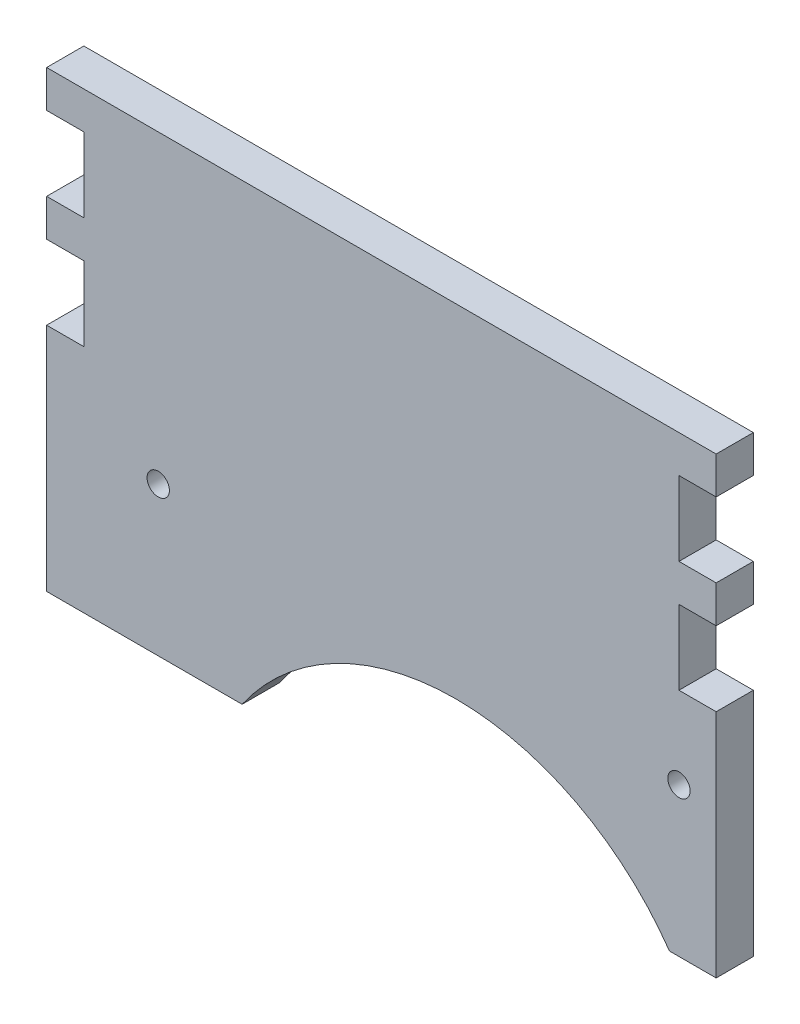
ISO-10303-21;
HEADER;
FILE_DESCRIPTION(('STEP AP214'),'2;1');
FILE_NAME('part.step','',(''),(''),'','','');
FILE_SCHEMA(('AUTOMOTIVE_DESIGN { 1 0 10303 214 1 1 1 1 }'));
ENDSEC;
DATA;
#1=APPLICATION_CONTEXT('core data for automotive mechanical design processes');
#2=APPLICATION_PROTOCOL_DEFINITION('international standard','automotive_design',2000,#1);
#3=PRODUCT_CONTEXT('',#1,'mechanical');
#4=PRODUCT('Part','Part','',(#3));
#5=PRODUCT_RELATED_PRODUCT_CATEGORY('part','',(#4));
#6=PRODUCT_DEFINITION_FORMATION('','',#4);
#7=PRODUCT_DEFINITION_CONTEXT('part definition',#1,'design');
#8=PRODUCT_DEFINITION('design','',#6,#7);
#9=PRODUCT_DEFINITION_SHAPE('','',#8);
#10=(LENGTH_UNIT() NAMED_UNIT(*) SI_UNIT(.MILLI.,.METRE.));
#11=(NAMED_UNIT(*) PLANE_ANGLE_UNIT() SI_UNIT($,.RADIAN.));
#12=(NAMED_UNIT(*) SI_UNIT($,.STERADIAN.) SOLID_ANGLE_UNIT());
#13=UNCERTAINTY_MEASURE_WITH_UNIT(LENGTH_MEASURE(1.E-05),#10,'distance_accuracy_value','');
#14=(GEOMETRIC_REPRESENTATION_CONTEXT(3) GLOBAL_UNCERTAINTY_ASSIGNED_CONTEXT((#13)) GLOBAL_UNIT_ASSIGNED_CONTEXT((#10,
#11,#12)) REPRESENTATION_CONTEXT('',''));
#15=CARTESIAN_POINT('',(0.,0.,0.));
#16=DIRECTION('',(0.,0.,1.));
#17=DIRECTION('',(1.,0.,0.));
#18=AXIS2_PLACEMENT_3D('',#15,#16,#17);
#19=CARTESIAN_POINT('',(0.,0.,5.));
#20=DIRECTION('',(0.,1.,0.));
#21=DIRECTION('',(0.,0.,1.));
#22=AXIS2_PLACEMENT_3D('',#19,#20,#21);
#23=PLANE('',#22);
#24=DIRECTION('',(1.,0.,0.));
#25=VECTOR('',#24,1.);
#26=CARTESIAN_POINT('',(0.,0.,0.));
#27=LINE('',#26,#25);
#28=CARTESIAN_POINT('',(0.,0.,0.));
#29=VERTEX_POINT('',#28);
#30=CARTESIAN_POINT('',(26.2771867673098,0.,0.));
#31=VERTEX_POINT('',#30);
#32=EDGE_CURVE('E224',#29,#31,#27,.T.);
#33=ORIENTED_EDGE('',*,*,#32,.T.);
#34=DIRECTION('',(0.,0.,-1.));
#35=VECTOR('',#34,1.);
#36=CARTESIAN_POINT('',(26.2771867673098,0.,5.));
#37=LINE('',#36,#35);
#38=CARTESIAN_POINT('',(26.2771867673098,0.,5.));
#39=VERTEX_POINT('',#38);
#40=EDGE_CURVE('E11',#39,#31,#37,.T.);
#41=ORIENTED_EDGE('',*,*,#40,.F.);
#42=DIRECTION('',(1.,0.,0.));
#43=VECTOR('',#42,1.);
#44=CARTESIAN_POINT('',(0.,0.,5.));
#45=LINE('',#44,#43);
#46=CARTESIAN_POINT('',(0.,0.,5.));
#47=VERTEX_POINT('',#46);
#48=EDGE_CURVE('E433',#47,#39,#45,.T.);
#49=ORIENTED_EDGE('',*,*,#48,.F.);
#50=DIRECTION('',(0.,0.,-1.));
#51=VECTOR('',#50,1.);
#52=CARTESIAN_POINT('',(0.,0.,5.));
#53=LINE('',#52,#51);
#54=EDGE_CURVE('E52',#47,#29,#53,.T.);
#55=ORIENTED_EDGE('',*,*,#54,.T.);
#56=EDGE_LOOP('',(#33,#41,#49,#55));
#57=FACE_BOUND('',#56,.T.);
#58=ADVANCED_FACE('F35',(#57),#23,.F.);
#59=CARTESIAN_POINT('',(55.,-20.,5.));
#60=DIRECTION('',(0.,0.,-1.));
#61=DIRECTION('',(-1.,0.,0.));
#62=AXIS2_PLACEMENT_3D('',#59,#60,#61);
#63=CYLINDRICAL_SURFACE('',#62,35.);
#64=CARTESIAN_POINT('',(55.,-20.,0.));
#65=DIRECTION('',(0.,0.,1.));
#66=DIRECTION('',(1.,0.,0.));
#67=AXIS2_PLACEMENT_3D('',#64,#65,#66);
#68=CIRCLE('',#67,35.);
#69=CARTESIAN_POINT('',(83.7228132326902,0.,0.));
#70=VERTEX_POINT('',#69);
#71=EDGE_CURVE('E226',#31,#70,#68,.F.);
#72=ORIENTED_EDGE('',*,*,#71,.T.);
#73=DIRECTION('',(0.,0.,-1.));
#74=VECTOR('',#73,1.);
#75=CARTESIAN_POINT('',(83.7228132326902,0.,5.));
#76=LINE('',#75,#74);
#77=CARTESIAN_POINT('',(83.7228132326902,0.,5.));
#78=VERTEX_POINT('',#77);
#79=EDGE_CURVE('E44',#78,#70,#76,.T.);
#80=ORIENTED_EDGE('',*,*,#79,.F.);
#81=CARTESIAN_POINT('',(55.,-20.,5.));
#82=DIRECTION('',(0.,0.,1.));
#83=DIRECTION('',(1.,0.,0.));
#84=AXIS2_PLACEMENT_3D('',#81,#82,#83);
#85=CIRCLE('',#84,35.);
#86=EDGE_CURVE('E132',#39,#78,#85,.F.);
#87=ORIENTED_EDGE('',*,*,#86,.F.);
#88=ORIENTED_EDGE('',*,*,#40,.T.);
#89=EDGE_LOOP('',(#72,#80,#87,#88));
#90=FACE_BOUND('',#89,.T.);
#91=ADVANCED_FACE('F397',(#90),#63,.F.);
#92=CARTESIAN_POINT('',(0.,0.,5.));
#93=DIRECTION('',(0.,1.,0.));
#94=DIRECTION('',(0.,0.,1.));
#95=AXIS2_PLACEMENT_3D('',#92,#93,#94);
#96=PLANE('',#95);
#97=DIRECTION('',(1.,0.,0.));
#98=VECTOR('',#97,1.);
#99=CARTESIAN_POINT('',(0.,0.,0.));
#100=LINE('',#99,#98);
#101=CARTESIAN_POINT('',(90.,0.,0.));
#102=VERTEX_POINT('',#101);
#103=EDGE_CURVE('E228',#70,#102,#100,.T.);
#104=ORIENTED_EDGE('',*,*,#103,.T.);
#105=DIRECTION('',(0.,0.,-1.));
#106=VECTOR('',#105,1.);
#107=CARTESIAN_POINT('',(90.,0.,5.));
#108=LINE('',#107,#106);
#109=CARTESIAN_POINT('',(90.,0.,5.));
#110=VERTEX_POINT('',#109);
#111=EDGE_CURVE('E317',#110,#102,#108,.T.);
#112=ORIENTED_EDGE('',*,*,#111,.F.);
#113=DIRECTION('',(1.,0.,0.));
#114=VECTOR('',#113,1.);
#115=CARTESIAN_POINT('',(0.,0.,5.));
#116=LINE('',#115,#114);
#117=EDGE_CURVE('E325',#78,#110,#116,.T.);
#118=ORIENTED_EDGE('',*,*,#117,.F.);
#119=ORIENTED_EDGE('',*,*,#79,.T.);
#120=EDGE_LOOP('',(#104,#112,#118,#119));
#121=FACE_BOUND('',#120,.T.);
#122=ADVANCED_FACE('F323',(#121),#96,.F.);
#123=CARTESIAN_POINT('',(90.,0.,5.));
#124=DIRECTION('',(-1.,0.,0.));
#125=DIRECTION('',(0.,-1.,0.));
#126=AXIS2_PLACEMENT_3D('',#123,#124,#125);
#127=PLANE('',#126);
#128=DIRECTION('',(0.,1.,0.));
#129=VECTOR('',#128,1.);
#130=CARTESIAN_POINT('',(90.,0.,0.));
#131=LINE('',#130,#129);
#132=CARTESIAN_POINT('',(90.,31.,0.));
#133=VERTEX_POINT('',#132);
#134=EDGE_CURVE('E230',#102,#133,#131,.T.);
#135=ORIENTED_EDGE('',*,*,#134,.T.);
#136=DIRECTION('',(0.,0.,-1.));
#137=VECTOR('',#136,1.);
#138=CARTESIAN_POINT('',(90.,31.,5.));
#139=LINE('',#138,#137);
#140=CARTESIAN_POINT('',(90.,31.,5.));
#141=VERTEX_POINT('',#140);
#142=EDGE_CURVE('E315',#141,#133,#139,.T.);
#143=ORIENTED_EDGE('',*,*,#142,.F.);
#144=DIRECTION('',(0.,1.,0.));
#145=VECTOR('',#144,1.);
#146=CARTESIAN_POINT('',(90.,0.,5.));
#147=LINE('',#146,#145);
#148=EDGE_CURVE('E335',#110,#141,#147,.T.);
#149=ORIENTED_EDGE('',*,*,#148,.F.);
#150=ORIENTED_EDGE('',*,*,#111,.T.);
#151=EDGE_LOOP('',(#135,#143,#149,#150));
#152=FACE_BOUND('',#151,.T.);
#153=ADVANCED_FACE('F332',(#152),#127,.F.);
#154=CARTESIAN_POINT('',(0.,31.,5.));
#155=DIRECTION('',(0.,1.,0.));
#156=DIRECTION('',(-1.,0.,0.));
#157=AXIS2_PLACEMENT_3D('',#154,#155,#156);
#158=PLANE('',#157);
#159=DIRECTION('',(1.,0.,0.));
#160=VECTOR('',#159,1.);
#161=CARTESIAN_POINT('',(0.,31.,0.));
#162=LINE('',#161,#160);
#163=CARTESIAN_POINT('',(85.,31.,0.));
#164=VERTEX_POINT('',#163);
#165=EDGE_CURVE('E233',#164,#133,#162,.T.);
#166=ORIENTED_EDGE('',*,*,#165,.F.);
#167=DIRECTION('',(0.,0.,-1.));
#168=VECTOR('',#167,1.);
#169=CARTESIAN_POINT('',(85.,31.,5.));
#170=LINE('',#169,#168);
#171=CARTESIAN_POINT('',(85.,31.,5.));
#172=VERTEX_POINT('',#171);
#173=EDGE_CURVE('E313',#172,#164,#170,.T.);
#174=ORIENTED_EDGE('',*,*,#173,.F.);
#175=DIRECTION('',(1.,0.,0.));
#176=VECTOR('',#175,1.);
#177=CARTESIAN_POINT('',(0.,31.,5.));
#178=LINE('',#177,#176);
#179=EDGE_CURVE('E337',#172,#141,#178,.T.);
#180=ORIENTED_EDGE('',*,*,#179,.T.);
#181=ORIENTED_EDGE('',*,*,#142,.T.);
#182=EDGE_LOOP('',(#166,#174,#180,#181));
#183=FACE_BOUND('',#182,.T.);
#184=ADVANCED_FACE('F589',(#183),#158,.T.);
#185=CARTESIAN_POINT('',(85.,0.,5.));
#186=DIRECTION('',(1.,0.,0.));
#187=DIRECTION('',(0.,0.,-1.));
#188=AXIS2_PLACEMENT_3D('',#185,#186,#187);
#189=PLANE('',#188);
#190=DIRECTION('',(0.,-1.,0.));
#191=VECTOR('',#190,1.);
#192=CARTESIAN_POINT('',(85.,0.,0.));
#193=LINE('',#192,#191);
#194=CARTESIAN_POINT('',(85.,41.,0.));
#195=VERTEX_POINT('',#194);
#196=EDGE_CURVE('E236',#195,#164,#193,.T.);
#197=ORIENTED_EDGE('',*,*,#196,.F.);
#198=DIRECTION('',(0.,0.,-1.));
#199=VECTOR('',#198,1.);
#200=CARTESIAN_POINT('',(85.,41.,5.));
#201=LINE('',#200,#199);
#202=CARTESIAN_POINT('',(85.,41.,5.));
#203=VERTEX_POINT('',#202);
#204=EDGE_CURVE('E311',#203,#195,#201,.T.);
#205=ORIENTED_EDGE('',*,*,#204,.F.);
#206=DIRECTION('',(0.,-1.,0.));
#207=VECTOR('',#206,1.);
#208=CARTESIAN_POINT('',(85.,0.,5.));
#209=LINE('',#208,#207);
#210=EDGE_CURVE('E339',#203,#172,#209,.T.);
#211=ORIENTED_EDGE('',*,*,#210,.T.);
#212=ORIENTED_EDGE('',*,*,#173,.T.);
#213=EDGE_LOOP('',(#197,#205,#211,#212));
#214=FACE_BOUND('',#213,.T.);
#215=ADVANCED_FACE('F580',(#214),#189,.T.);
#216=CARTESIAN_POINT('',(0.,41.,5.));
#217=DIRECTION('',(0.,1.,0.));
#218=DIRECTION('',(0.,0.,1.));
#219=AXIS2_PLACEMENT_3D('',#216,#217,#218);
#220=PLANE('',#219);
#221=DIRECTION('',(1.,0.,0.));
#222=VECTOR('',#221,1.);
#223=CARTESIAN_POINT('',(0.,41.,0.));
#224=LINE('',#223,#222);
#225=CARTESIAN_POINT('',(90.,41.,0.));
#226=VERTEX_POINT('',#225);
#227=EDGE_CURVE('E239',#195,#226,#224,.T.);
#228=ORIENTED_EDGE('',*,*,#227,.T.);
#229=DIRECTION('',(0.,0.,-1.));
#230=VECTOR('',#229,1.);
#231=CARTESIAN_POINT('',(90.,41.,5.));
#232=LINE('',#231,#230);
#233=CARTESIAN_POINT('',(90.,41.,5.));
#234=VERTEX_POINT('',#233);
#235=EDGE_CURVE('E308',#234,#226,#232,.T.);
#236=ORIENTED_EDGE('',*,*,#235,.F.);
#237=DIRECTION('',(1.,0.,0.));
#238=VECTOR('',#237,1.);
#239=CARTESIAN_POINT('',(0.,41.,5.));
#240=LINE('',#239,#238);
#241=EDGE_CURVE('E346',#203,#234,#240,.T.);
#242=ORIENTED_EDGE('',*,*,#241,.F.);
#243=ORIENTED_EDGE('',*,*,#204,.T.);
#244=EDGE_LOOP('',(#228,#236,#242,#243));
#245=FACE_BOUND('',#244,.T.);
#246=ADVANCED_FACE('F571',(#245),#220,.F.);
#247=CARTESIAN_POINT('',(90.0000000000001,2.49800180540661E-13,5.));
#248=DIRECTION('',(-1.,0.,0.));
#249=DIRECTION('',(0.,-1.,0.));
#250=AXIS2_PLACEMENT_3D('',#247,#248,#249);
#251=PLANE('',#250);
#252=DIRECTION('',(0.,1.,0.));
#253=VECTOR('',#252,1.);
#254=CARTESIAN_POINT('',(90.0000000000001,2.49800180540661E-13,0.));
#255=LINE('',#254,#253);
#256=CARTESIAN_POINT('',(90.,46.,0.));
#257=VERTEX_POINT('',#256);
#258=EDGE_CURVE('E241',#226,#257,#255,.T.);
#259=ORIENTED_EDGE('',*,*,#258,.T.);
#260=DIRECTION('',(0.,0.,-1.));
#261=VECTOR('',#260,1.);
#262=CARTESIAN_POINT('',(90.,46.,5.));
#263=LINE('',#262,#261);
#264=CARTESIAN_POINT('',(90.,46.,5.));
#265=VERTEX_POINT('',#264);
#266=EDGE_CURVE('E306',#265,#257,#263,.T.);
#267=ORIENTED_EDGE('',*,*,#266,.F.);
#268=DIRECTION('',(0.,1.,0.));
#269=VECTOR('',#268,1.);
#270=CARTESIAN_POINT('',(90.0000000000001,2.49800180540661E-13,5.));
#271=LINE('',#270,#269);
#272=EDGE_CURVE('E348',#234,#265,#271,.T.);
#273=ORIENTED_EDGE('',*,*,#272,.F.);
#274=ORIENTED_EDGE('',*,*,#235,.T.);
#275=EDGE_LOOP('',(#259,#267,#273,#274));
#276=FACE_BOUND('',#275,.T.);
#277=ADVANCED_FACE('F562',(#276),#251,.F.);
#278=CARTESIAN_POINT('',(0.,46.,5.));
#279=DIRECTION('',(0.,1.,0.));
#280=DIRECTION('',(0.,0.,1.));
#281=AXIS2_PLACEMENT_3D('',#278,#279,#280);
#282=PLANE('',#281);
#283=DIRECTION('',(1.,0.,0.));
#284=VECTOR('',#283,1.);
#285=CARTESIAN_POINT('',(0.,46.,0.));
#286=LINE('',#285,#284);
#287=CARTESIAN_POINT('',(85.,46.,0.));
#288=VERTEX_POINT('',#287);
#289=EDGE_CURVE('E244',#288,#257,#286,.T.);
#290=ORIENTED_EDGE('',*,*,#289,.F.);
#291=DIRECTION('',(0.,0.,-1.));
#292=VECTOR('',#291,1.);
#293=CARTESIAN_POINT('',(85.,46.,5.));
#294=LINE('',#293,#292);
#295=CARTESIAN_POINT('',(85.,46.,5.));
#296=VERTEX_POINT('',#295);
#297=EDGE_CURVE('E304',#296,#288,#294,.T.);
#298=ORIENTED_EDGE('',*,*,#297,.F.);
#299=DIRECTION('',(1.,0.,0.));
#300=VECTOR('',#299,1.);
#301=CARTESIAN_POINT('',(0.,46.,5.));
#302=LINE('',#301,#300);
#303=EDGE_CURVE('E350',#296,#265,#302,.T.);
#304=ORIENTED_EDGE('',*,*,#303,.T.);
#305=ORIENTED_EDGE('',*,*,#266,.T.);
#306=EDGE_LOOP('',(#290,#298,#304,#305));
#307=FACE_BOUND('',#306,.T.);
#308=ADVANCED_FACE('F553',(#307),#282,.T.);
#309=CARTESIAN_POINT('',(85.,0.,5.));
#310=DIRECTION('',(1.,0.,0.));
#311=DIRECTION('',(0.,0.,-1.));
#312=AXIS2_PLACEMENT_3D('',#309,#310,#311);
#313=PLANE('',#312);
#314=DIRECTION('',(0.,-1.,0.));
#315=VECTOR('',#314,1.);
#316=CARTESIAN_POINT('',(85.,0.,0.));
#317=LINE('',#316,#315);
#318=CARTESIAN_POINT('',(85.,56.,0.));
#319=VERTEX_POINT('',#318);
#320=EDGE_CURVE('E247',#319,#288,#317,.T.);
#321=ORIENTED_EDGE('',*,*,#320,.F.);
#322=DIRECTION('',(0.,0.,-1.));
#323=VECTOR('',#322,1.);
#324=CARTESIAN_POINT('',(85.,56.,5.));
#325=LINE('',#324,#323);
#326=CARTESIAN_POINT('',(85.,56.,5.));
#327=VERTEX_POINT('',#326);
#328=EDGE_CURVE('E302',#327,#319,#325,.T.);
#329=ORIENTED_EDGE('',*,*,#328,.F.);
#330=DIRECTION('',(0.,-1.,0.));
#331=VECTOR('',#330,1.);
#332=CARTESIAN_POINT('',(85.,0.,5.));
#333=LINE('',#332,#331);
#334=EDGE_CURVE('E353',#327,#296,#333,.T.);
#335=ORIENTED_EDGE('',*,*,#334,.T.);
#336=ORIENTED_EDGE('',*,*,#297,.T.);
#337=EDGE_LOOP('',(#321,#329,#335,#336));
#338=FACE_BOUND('',#337,.T.);
#339=ADVANCED_FACE('F544',(#338),#313,.T.);
#340=CARTESIAN_POINT('',(0.,56.,5.));
#341=DIRECTION('',(0.,1.,0.));
#342=DIRECTION('',(0.,0.,1.));
#343=AXIS2_PLACEMENT_3D('',#340,#341,#342);
#344=PLANE('',#343);
#345=DIRECTION('',(1.,0.,0.));
#346=VECTOR('',#345,1.);
#347=CARTESIAN_POINT('',(0.,56.,0.));
#348=LINE('',#347,#346);
#349=CARTESIAN_POINT('',(90.,56.,0.));
#350=VERTEX_POINT('',#349);
#351=EDGE_CURVE('E250',#319,#350,#348,.T.);
#352=ORIENTED_EDGE('',*,*,#351,.T.);
#353=DIRECTION('',(0.,0.,-1.));
#354=VECTOR('',#353,1.);
#355=CARTESIAN_POINT('',(90.,56.,5.));
#356=LINE('',#355,#354);
#357=CARTESIAN_POINT('',(90.,56.,5.));
#358=VERTEX_POINT('',#357);
#359=EDGE_CURVE('E299',#358,#350,#356,.T.);
#360=ORIENTED_EDGE('',*,*,#359,.F.);
#361=DIRECTION('',(1.,0.,0.));
#362=VECTOR('',#361,1.);
#363=CARTESIAN_POINT('',(0.,56.,5.));
#364=LINE('',#363,#362);
#365=EDGE_CURVE('E356',#327,#358,#364,.T.);
#366=ORIENTED_EDGE('',*,*,#365,.F.);
#367=ORIENTED_EDGE('',*,*,#328,.T.);
#368=EDGE_LOOP('',(#352,#360,#366,#367));
#369=FACE_BOUND('',#368,.T.);
#370=ADVANCED_FACE('F535',(#369),#344,.F.);
#371=CARTESIAN_POINT('',(90.,0.,5.));
#372=DIRECTION('',(-1.,0.,0.));
#373=DIRECTION('',(0.,0.,1.));
#374=AXIS2_PLACEMENT_3D('',#371,#372,#373);
#375=PLANE('',#374);
#376=DIRECTION('',(0.,1.,0.));
#377=VECTOR('',#376,1.);
#378=CARTESIAN_POINT('',(90.,0.,0.));
#379=LINE('',#378,#377);
#380=CARTESIAN_POINT('',(90.,61.,0.));
#381=VERTEX_POINT('',#380);
#382=EDGE_CURVE('E252',#350,#381,#379,.T.);
#383=ORIENTED_EDGE('',*,*,#382,.T.);
#384=DIRECTION('',(0.,0.,-1.));
#385=VECTOR('',#384,1.);
#386=CARTESIAN_POINT('',(90.,61.,5.));
#387=LINE('',#386,#385);
#388=CARTESIAN_POINT('',(90.,61.,5.));
#389=VERTEX_POINT('',#388);
#390=EDGE_CURVE('E297',#389,#381,#387,.T.);
#391=ORIENTED_EDGE('',*,*,#390,.F.);
#392=DIRECTION('',(0.,1.,0.));
#393=VECTOR('',#392,1.);
#394=CARTESIAN_POINT('',(90.,0.,5.));
#395=LINE('',#394,#393);
#396=EDGE_CURVE('E358',#358,#389,#395,.T.);
#397=ORIENTED_EDGE('',*,*,#396,.F.);
#398=ORIENTED_EDGE('',*,*,#359,.T.);
#399=EDGE_LOOP('',(#383,#391,#397,#398));
#400=FACE_BOUND('',#399,.T.);
#401=ADVANCED_FACE('F526',(#400),#375,.F.);
#402=CARTESIAN_POINT('',(0.,61.,5.));
#403=DIRECTION('',(0.,1.,0.));
#404=DIRECTION('',(0.,0.,1.));
#405=AXIS2_PLACEMENT_3D('',#402,#403,#404);
#406=PLANE('',#405);
#407=DIRECTION('',(1.,0.,0.));
#408=VECTOR('',#407,1.);
#409=CARTESIAN_POINT('',(0.,61.,0.));
#410=LINE('',#409,#408);
#411=CARTESIAN_POINT('',(0.,61.,0.));
#412=VERTEX_POINT('',#411);
#413=EDGE_CURVE('E255',#412,#381,#410,.T.);
#414=ORIENTED_EDGE('',*,*,#413,.F.);
#415=DIRECTION('',(0.,0.,-1.));
#416=VECTOR('',#415,1.);
#417=CARTESIAN_POINT('',(0.,61.,5.));
#418=LINE('',#417,#416);
#419=CARTESIAN_POINT('',(0.,61.,5.));
#420=VERTEX_POINT('',#419);
#421=EDGE_CURVE('E295',#420,#412,#418,.T.);
#422=ORIENTED_EDGE('',*,*,#421,.F.);
#423=DIRECTION('',(1.,0.,0.));
#424=VECTOR('',#423,1.);
#425=CARTESIAN_POINT('',(0.,61.,5.));
#426=LINE('',#425,#424);
#427=EDGE_CURVE('E360',#420,#389,#426,.T.);
#428=ORIENTED_EDGE('',*,*,#427,.T.);
#429=ORIENTED_EDGE('',*,*,#390,.T.);
#430=EDGE_LOOP('',(#414,#422,#428,#429));
#431=FACE_BOUND('',#430,.T.);
#432=ADVANCED_FACE('F517',(#431),#406,.T.);
#433=CARTESIAN_POINT('',(0.,0.,5.));
#434=DIRECTION('',(-1.,0.,0.));
#435=DIRECTION('',(0.,0.,1.));
#436=AXIS2_PLACEMENT_3D('',#433,#434,#435);
#437=PLANE('',#436);
#438=DIRECTION('',(0.,1.,0.));
#439=VECTOR('',#438,1.);
#440=CARTESIAN_POINT('',(0.,0.,0.));
#441=LINE('',#440,#439);
#442=CARTESIAN_POINT('',(0.,56.,0.));
#443=VERTEX_POINT('',#442);
#444=EDGE_CURVE('E258',#443,#412,#441,.T.);
#445=ORIENTED_EDGE('',*,*,#444,.F.);
#446=DIRECTION('',(0.,0.,-1.));
#447=VECTOR('',#446,1.);
#448=CARTESIAN_POINT('',(0.,56.,5.));
#449=LINE('',#448,#447);
#450=CARTESIAN_POINT('',(0.,56.,5.));
#451=VERTEX_POINT('',#450);
#452=EDGE_CURVE('E293',#451,#443,#449,.T.);
#453=ORIENTED_EDGE('',*,*,#452,.F.);
#454=DIRECTION('',(0.,1.,0.));
#455=VECTOR('',#454,1.);
#456=CARTESIAN_POINT('',(0.,0.,5.));
#457=LINE('',#456,#455);
#458=EDGE_CURVE('E363',#451,#420,#457,.T.);
#459=ORIENTED_EDGE('',*,*,#458,.T.);
#460=ORIENTED_EDGE('',*,*,#421,.T.);
#461=EDGE_LOOP('',(#445,#453,#459,#460));
#462=FACE_BOUND('',#461,.T.);
#463=ADVANCED_FACE('F508',(#462),#437,.T.);
#464=CARTESIAN_POINT('',(0.,56.,5.));
#465=DIRECTION('',(0.,1.,0.));
#466=DIRECTION('',(0.,0.,1.));
#467=AXIS2_PLACEMENT_3D('',#464,#465,#466);
#468=PLANE('',#467);
#469=DIRECTION('',(1.,0.,0.));
#470=VECTOR('',#469,1.);
#471=CARTESIAN_POINT('',(0.,56.,0.));
#472=LINE('',#471,#470);
#473=CARTESIAN_POINT('',(5.,56.,0.));
#474=VERTEX_POINT('',#473);
#475=EDGE_CURVE('E261',#443,#474,#472,.T.);
#476=ORIENTED_EDGE('',*,*,#475,.T.);
#477=DIRECTION('',(0.,0.,-1.));
#478=VECTOR('',#477,1.);
#479=CARTESIAN_POINT('',(5.,56.,5.));
#480=LINE('',#479,#478);
#481=CARTESIAN_POINT('',(5.,56.,5.));
#482=VERTEX_POINT('',#481);
#483=EDGE_CURVE('E290',#482,#474,#480,.T.);
#484=ORIENTED_EDGE('',*,*,#483,.F.);
#485=DIRECTION('',(1.,0.,0.));
#486=VECTOR('',#485,1.);
#487=CARTESIAN_POINT('',(0.,56.,5.));
#488=LINE('',#487,#486);
#489=EDGE_CURVE('E366',#451,#482,#488,.T.);
#490=ORIENTED_EDGE('',*,*,#489,.F.);
#491=ORIENTED_EDGE('',*,*,#452,.T.);
#492=EDGE_LOOP('',(#476,#484,#490,#491));
#493=FACE_BOUND('',#492,.T.);
#494=ADVANCED_FACE('F499',(#493),#468,.F.);
#495=CARTESIAN_POINT('',(5.00000000000001,0.,5.));
#496=DIRECTION('',(1.,0.,0.));
#497=DIRECTION('',(0.,1.,0.));
#498=AXIS2_PLACEMENT_3D('',#495,#496,#497);
#499=PLANE('',#498);
#500=DIRECTION('',(0.,-1.,0.));
#501=VECTOR('',#500,1.);
#502=CARTESIAN_POINT('',(5.00000000000001,0.,0.));
#503=LINE('',#502,#501);
#504=CARTESIAN_POINT('',(5.00000000000001,46.,0.));
#505=VERTEX_POINT('',#504);
#506=EDGE_CURVE('E263',#474,#505,#503,.T.);
#507=ORIENTED_EDGE('',*,*,#506,.T.);
#508=DIRECTION('',(0.,0.,-1.));
#509=VECTOR('',#508,1.);
#510=CARTESIAN_POINT('',(5.00000000000001,46.,5.));
#511=LINE('',#510,#509);
#512=CARTESIAN_POINT('',(5.00000000000001,46.,5.));
#513=VERTEX_POINT('',#512);
#514=EDGE_CURVE('E288',#513,#505,#511,.T.);
#515=ORIENTED_EDGE('',*,*,#514,.F.);
#516=DIRECTION('',(0.,-1.,0.));
#517=VECTOR('',#516,1.);
#518=CARTESIAN_POINT('',(5.00000000000001,0.,5.));
#519=LINE('',#518,#517);
#520=EDGE_CURVE('E368',#482,#513,#519,.T.);
#521=ORIENTED_EDGE('',*,*,#520,.F.);
#522=ORIENTED_EDGE('',*,*,#483,.T.);
#523=EDGE_LOOP('',(#507,#515,#521,#522));
#524=FACE_BOUND('',#523,.T.);
#525=ADVANCED_FACE('F491',(#524),#499,.F.);
#526=CARTESIAN_POINT('',(0.,46.,5.));
#527=DIRECTION('',(0.,1.,0.));
#528=DIRECTION('',(0.,0.,1.));
#529=AXIS2_PLACEMENT_3D('',#526,#527,#528);
#530=PLANE('',#529);
#531=DIRECTION('',(1.,0.,0.));
#532=VECTOR('',#531,1.);
#533=CARTESIAN_POINT('',(0.,46.,0.));
#534=LINE('',#533,#532);
#535=CARTESIAN_POINT('',(0.,46.,0.));
#536=VERTEX_POINT('',#535);
#537=EDGE_CURVE('E266',#536,#505,#534,.T.);
#538=ORIENTED_EDGE('',*,*,#537,.F.);
#539=DIRECTION('',(0.,0.,-1.));
#540=VECTOR('',#539,1.);
#541=CARTESIAN_POINT('',(0.,46.,5.));
#542=LINE('',#541,#540);
#543=CARTESIAN_POINT('',(0.,46.,5.));
#544=VERTEX_POINT('',#543);
#545=EDGE_CURVE('E286',#544,#536,#542,.T.);
#546=ORIENTED_EDGE('',*,*,#545,.F.);
#547=DIRECTION('',(1.,0.,0.));
#548=VECTOR('',#547,1.);
#549=CARTESIAN_POINT('',(0.,46.,5.));
#550=LINE('',#549,#548);
#551=EDGE_CURVE('E370',#544,#513,#550,.T.);
#552=ORIENTED_EDGE('',*,*,#551,.T.);
#553=ORIENTED_EDGE('',*,*,#514,.T.);
#554=EDGE_LOOP('',(#538,#546,#552,#553));
#555=FACE_BOUND('',#554,.T.);
#556=ADVANCED_FACE('F383',(#555),#530,.T.);
#557=CARTESIAN_POINT('',(0.,0.,5.));
#558=DIRECTION('',(-1.,0.,0.));
#559=DIRECTION('',(0.,-1.,0.));
#560=AXIS2_PLACEMENT_3D('',#557,#558,#559);
#561=PLANE('',#560);
#562=DIRECTION('',(0.,1.,0.));
#563=VECTOR('',#562,1.);
#564=CARTESIAN_POINT('',(0.,0.,0.));
#565=LINE('',#564,#563);
#566=CARTESIAN_POINT('',(0.,41.,0.));
#567=VERTEX_POINT('',#566);
#568=EDGE_CURVE('E269',#567,#536,#565,.T.);
#569=ORIENTED_EDGE('',*,*,#568,.F.);
#570=DIRECTION('',(0.,0.,-1.));
#571=VECTOR('',#570,1.);
#572=CARTESIAN_POINT('',(0.,41.,5.));
#573=LINE('',#572,#571);
#574=CARTESIAN_POINT('',(0.,41.,5.));
#575=VERTEX_POINT('',#574);
#576=EDGE_CURVE('E284',#575,#567,#573,.T.);
#577=ORIENTED_EDGE('',*,*,#576,.F.);
#578=DIRECTION('',(0.,1.,0.));
#579=VECTOR('',#578,1.);
#580=CARTESIAN_POINT('',(0.,0.,5.));
#581=LINE('',#580,#579);
#582=EDGE_CURVE('E373',#575,#544,#581,.T.);
#583=ORIENTED_EDGE('',*,*,#582,.T.);
#584=ORIENTED_EDGE('',*,*,#545,.T.);
#585=EDGE_LOOP('',(#569,#577,#583,#584));
#586=FACE_BOUND('',#585,.T.);
#587=ADVANCED_FACE('F377',(#586),#561,.T.);
#588=CARTESIAN_POINT('',(0.,41.,5.));
#589=DIRECTION('',(0.,1.,0.));
#590=DIRECTION('',(0.,0.,1.));
#591=AXIS2_PLACEMENT_3D('',#588,#589,#590);
#592=PLANE('',#591);
#593=DIRECTION('',(1.,0.,0.));
#594=VECTOR('',#593,1.);
#595=CARTESIAN_POINT('',(0.,41.,0.));
#596=LINE('',#595,#594);
#597=CARTESIAN_POINT('',(5.00000000000001,41.,0.));
#598=VERTEX_POINT('',#597);
#599=EDGE_CURVE('E272',#567,#598,#596,.T.);
#600=ORIENTED_EDGE('',*,*,#599,.T.);
#601=DIRECTION('',(0.,0.,-1.));
#602=VECTOR('',#601,1.);
#603=CARTESIAN_POINT('',(5.00000000000001,41.,5.));
#604=LINE('',#603,#602);
#605=CARTESIAN_POINT('',(5.00000000000001,41.,5.));
#606=VERTEX_POINT('',#605);
#607=EDGE_CURVE('E210',#606,#598,#604,.T.);
#608=ORIENTED_EDGE('',*,*,#607,.F.);
#609=DIRECTION('',(1.,0.,0.));
#610=VECTOR('',#609,1.);
#611=CARTESIAN_POINT('',(0.,41.,5.));
#612=LINE('',#611,#610);
#613=EDGE_CURVE('E198',#575,#606,#612,.T.);
#614=ORIENTED_EDGE('',*,*,#613,.F.);
#615=ORIENTED_EDGE('',*,*,#576,.T.);
#616=EDGE_LOOP('',(#600,#608,#614,#615));
#617=FACE_BOUND('',#616,.T.);
#618=ADVANCED_FACE('F387',(#617),#592,.F.);
#619=CARTESIAN_POINT('',(5.00000000000001,0.,5.));
#620=DIRECTION('',(1.,0.,0.));
#621=DIRECTION('',(0.,1.,0.));
#622=AXIS2_PLACEMENT_3D('',#619,#620,#621);
#623=PLANE('',#622);
#624=DIRECTION('',(0.,-1.,0.));
#625=VECTOR('',#624,1.);
#626=CARTESIAN_POINT('',(5.00000000000001,0.,0.));
#627=LINE('',#626,#625);
#628=CARTESIAN_POINT('',(5.00000000000001,31.,0.));
#629=VERTEX_POINT('',#628);
#630=EDGE_CURVE('E207',#598,#629,#627,.T.);
#631=ORIENTED_EDGE('',*,*,#630,.T.);
#632=DIRECTION('',(0.,0.,-1.));
#633=VECTOR('',#632,1.);
#634=CARTESIAN_POINT('',(5.00000000000001,31.,5.));
#635=LINE('',#634,#633);
#636=CARTESIAN_POINT('',(5.00000000000001,31.,5.));
#637=VERTEX_POINT('',#636);
#638=EDGE_CURVE('E204',#637,#629,#635,.T.);
#639=ORIENTED_EDGE('',*,*,#638,.F.);
#640=DIRECTION('',(0.,-1.,0.));
#641=VECTOR('',#640,1.);
#642=CARTESIAN_POINT('',(5.00000000000001,0.,5.));
#643=LINE('',#642,#641);
#644=EDGE_CURVE('E190',#606,#637,#643,.T.);
#645=ORIENTED_EDGE('',*,*,#644,.F.);
#646=ORIENTED_EDGE('',*,*,#607,.T.);
#647=EDGE_LOOP('',(#631,#639,#645,#646));
#648=FACE_BOUND('',#647,.T.);
#649=ADVANCED_FACE('F205',(#648),#623,.F.);
#650=CARTESIAN_POINT('',(0.,31.,5.));
#651=DIRECTION('',(0.,1.,0.));
#652=DIRECTION('',(0.,0.,1.));
#653=AXIS2_PLACEMENT_3D('',#650,#651,#652);
#654=PLANE('',#653);
#655=DIRECTION('',(1.,0.,0.));
#656=VECTOR('',#655,1.);
#657=CARTESIAN_POINT('',(0.,31.,0.));
#658=LINE('',#657,#656);
#659=CARTESIAN_POINT('',(0.,31.,0.));
#660=VERTEX_POINT('',#659);
#661=EDGE_CURVE('E275',#660,#629,#658,.T.);
#662=ORIENTED_EDGE('',*,*,#661,.F.);
#663=DIRECTION('',(0.,0.,-1.));
#664=VECTOR('',#663,1.);
#665=CARTESIAN_POINT('',(0.,31.,5.));
#666=LINE('',#665,#664);
#667=CARTESIAN_POINT('',(0.,31.,5.));
#668=VERTEX_POINT('',#667);
#669=EDGE_CURVE('E120',#668,#660,#666,.T.);
#670=ORIENTED_EDGE('',*,*,#669,.F.);
#671=DIRECTION('',(1.,0.,0.));
#672=VECTOR('',#671,1.);
#673=CARTESIAN_POINT('',(0.,31.,5.));
#674=LINE('',#673,#672);
#675=EDGE_CURVE('E195',#668,#637,#674,.T.);
#676=ORIENTED_EDGE('',*,*,#675,.T.);
#677=ORIENTED_EDGE('',*,*,#638,.T.);
#678=EDGE_LOOP('',(#662,#670,#676,#677));
#679=FACE_BOUND('',#678,.T.);
#680=ADVANCED_FACE('F212',(#679),#654,.T.);
#681=CARTESIAN_POINT('',(85.,20.,5.));
#682=DIRECTION('',(0.,0.,-1.));
#683=DIRECTION('',(-1.,0.,0.));
#684=AXIS2_PLACEMENT_3D('',#681,#682,#683);
#685=CYLINDRICAL_SURFACE('',#684,1.5);
#686=CARTESIAN_POINT('',(85.,20.,5.));
#687=DIRECTION('',(0.,0.,1.));
#688=DIRECTION('',(1.,0.,0.));
#689=AXIS2_PLACEMENT_3D('',#686,#687,#688);
#690=CIRCLE('',#689,1.5);
#691=CARTESIAN_POINT('',(86.5,20.,5.));
#692=VERTEX_POINT('',#691);
#693=EDGE_CURVE('E417',#692,#692,#690,.T.);
#694=ORIENTED_EDGE('',*,*,#693,.T.);
#695=EDGE_LOOP('',(#694));
#696=FACE_BOUND('',#695,.T.);
#697=CARTESIAN_POINT('',(85.,20.,0.));
#698=DIRECTION('',(0.,0.,1.));
#699=DIRECTION('',(1.,0.,0.));
#700=AXIS2_PLACEMENT_3D('',#697,#698,#699);
#701=CIRCLE('',#700,1.5);
#702=CARTESIAN_POINT('',(86.5,20.,0.));
#703=VERTEX_POINT('',#702);
#704=EDGE_CURVE('E221',#703,#703,#701,.T.);
#705=ORIENTED_EDGE('',*,*,#704,.F.);
#706=EDGE_LOOP('',(#705));
#707=FACE_BOUND('',#706,.T.);
#708=ADVANCED_FACE('F404',(#696,#707),#685,.F.);
#709=CARTESIAN_POINT('',(15.,20.,5.));
#710=DIRECTION('',(0.,0.,-1.));
#711=DIRECTION('',(-1.,0.,0.));
#712=AXIS2_PLACEMENT_3D('',#709,#710,#711);
#713=CYLINDRICAL_SURFACE('',#712,1.5);
#714=CARTESIAN_POINT('',(15.,20.,5.));
#715=DIRECTION('',(0.,0.,1.));
#716=DIRECTION('',(1.,0.,0.));
#717=AXIS2_PLACEMENT_3D('',#714,#715,#716);
#718=CIRCLE('',#717,1.5);
#719=CARTESIAN_POINT('',(16.5,20.,5.));
#720=VERTEX_POINT('',#719);
#721=EDGE_CURVE('E280',#720,#720,#718,.T.);
#722=ORIENTED_EDGE('',*,*,#721,.T.);
#723=EDGE_LOOP('',(#722));
#724=FACE_BOUND('',#723,.T.);
#725=CARTESIAN_POINT('',(15.,20.,0.));
#726=DIRECTION('',(0.,0.,1.));
#727=DIRECTION('',(1.,0.,0.));
#728=AXIS2_PLACEMENT_3D('',#725,#726,#727);
#729=CIRCLE('',#728,1.5);
#730=CARTESIAN_POINT('',(16.5,20.,0.));
#731=VERTEX_POINT('',#730);
#732=EDGE_CURVE('E218',#731,#731,#729,.T.);
#733=ORIENTED_EDGE('',*,*,#732,.F.);
#734=EDGE_LOOP('',(#733));
#735=FACE_BOUND('',#734,.T.);
#736=ADVANCED_FACE('F37',(#724,#735),#713,.F.);
#737=CARTESIAN_POINT('',(0.,0.,5.));
#738=DIRECTION('',(-1.,0.,0.));
#739=DIRECTION('',(0.,-1.,0.));
#740=AXIS2_PLACEMENT_3D('',#737,#738,#739);
#741=PLANE('',#740);
#742=DIRECTION('',(0.,1.,0.));
#743=VECTOR('',#742,1.);
#744=CARTESIAN_POINT('',(0.,0.,0.));
#745=LINE('',#744,#743);
#746=EDGE_CURVE('E277',#29,#660,#745,.T.);
#747=ORIENTED_EDGE('',*,*,#746,.F.);
#748=ORIENTED_EDGE('',*,*,#54,.F.);
#749=DIRECTION('',(0.,1.,0.));
#750=VECTOR('',#749,1.);
#751=CARTESIAN_POINT('',(0.,0.,5.));
#752=LINE('',#751,#750);
#753=EDGE_CURVE('E213',#47,#668,#752,.T.);
#754=ORIENTED_EDGE('',*,*,#753,.T.);
#755=ORIENTED_EDGE('',*,*,#669,.T.);
#756=EDGE_LOOP('',(#747,#748,#754,#755));
#757=FACE_BOUND('',#756,.T.);
#758=ADVANCED_FACE('F411',(#757),#741,.T.);
#759=CARTESIAN_POINT('',(0.,0.,5.));
#760=DIRECTION('',(0.,0.,1.));
#761=DIRECTION('',(1.,0.,0.));
#762=AXIS2_PLACEMENT_3D('',#759,#760,#761);
#763=PLANE('',#762);
#764=ORIENTED_EDGE('',*,*,#721,.F.);
#765=EDGE_LOOP('',(#764));
#766=FACE_BOUND('',#765,.T.);
#767=ORIENTED_EDGE('',*,*,#693,.F.);
#768=EDGE_LOOP('',(#767));
#769=FACE_BOUND('',#768,.T.);
#770=ORIENTED_EDGE('',*,*,#48,.T.);
#771=ORIENTED_EDGE('',*,*,#86,.T.);
#772=ORIENTED_EDGE('',*,*,#117,.T.);
#773=ORIENTED_EDGE('',*,*,#148,.T.);
#774=ORIENTED_EDGE('',*,*,#179,.F.);
#775=ORIENTED_EDGE('',*,*,#210,.F.);
#776=ORIENTED_EDGE('',*,*,#241,.T.);
#777=ORIENTED_EDGE('',*,*,#272,.T.);
#778=ORIENTED_EDGE('',*,*,#303,.F.);
#779=ORIENTED_EDGE('',*,*,#334,.F.);
#780=ORIENTED_EDGE('',*,*,#365,.T.);
#781=ORIENTED_EDGE('',*,*,#396,.T.);
#782=ORIENTED_EDGE('',*,*,#427,.F.);
#783=ORIENTED_EDGE('',*,*,#458,.F.);
#784=ORIENTED_EDGE('',*,*,#489,.T.);
#785=ORIENTED_EDGE('',*,*,#520,.T.);
#786=ORIENTED_EDGE('',*,*,#551,.F.);
#787=ORIENTED_EDGE('',*,*,#582,.F.);
#788=ORIENTED_EDGE('',*,*,#613,.T.);
#789=ORIENTED_EDGE('',*,*,#644,.T.);
#790=ORIENTED_EDGE('',*,*,#675,.F.);
#791=ORIENTED_EDGE('',*,*,#753,.F.);
#792=EDGE_LOOP('',(#770,#771,#772,#773,#774,#775,#776,#777,#778,#779,#780,#781,#782,#783,#784,
#785,#786,#787,#788,#789,#790,#791));
#793=FACE_BOUND('',#792,.T.);
#794=ADVANCED_FACE('F192',(#766,#769,#793),#763,.T.);
#795=CARTESIAN_POINT('',(0.,0.,0.));
#796=DIRECTION('',(0.,0.,1.));
#797=DIRECTION('',(1.,0.,0.));
#798=AXIS2_PLACEMENT_3D('',#795,#796,#797);
#799=PLANE('',#798);
#800=ORIENTED_EDGE('',*,*,#732,.T.);
#801=EDGE_LOOP('',(#800));
#802=FACE_BOUND('',#801,.T.);
#803=ORIENTED_EDGE('',*,*,#704,.T.);
#804=EDGE_LOOP('',(#803));
#805=FACE_BOUND('',#804,.T.);
#806=ORIENTED_EDGE('',*,*,#32,.F.);
#807=ORIENTED_EDGE('',*,*,#746,.T.);
#808=ORIENTED_EDGE('',*,*,#661,.T.);
#809=ORIENTED_EDGE('',*,*,#630,.F.);
#810=ORIENTED_EDGE('',*,*,#599,.F.);
#811=ORIENTED_EDGE('',*,*,#568,.T.);
#812=ORIENTED_EDGE('',*,*,#537,.T.);
#813=ORIENTED_EDGE('',*,*,#506,.F.);
#814=ORIENTED_EDGE('',*,*,#475,.F.);
#815=ORIENTED_EDGE('',*,*,#444,.T.);
#816=ORIENTED_EDGE('',*,*,#413,.T.);
#817=ORIENTED_EDGE('',*,*,#382,.F.);
#818=ORIENTED_EDGE('',*,*,#351,.F.);
#819=ORIENTED_EDGE('',*,*,#320,.T.);
#820=ORIENTED_EDGE('',*,*,#289,.T.);
#821=ORIENTED_EDGE('',*,*,#258,.F.);
#822=ORIENTED_EDGE('',*,*,#227,.F.);
#823=ORIENTED_EDGE('',*,*,#196,.T.);
#824=ORIENTED_EDGE('',*,*,#165,.T.);
#825=ORIENTED_EDGE('',*,*,#134,.F.);
#826=ORIENTED_EDGE('',*,*,#103,.F.);
#827=ORIENTED_EDGE('',*,*,#71,.F.);
#828=EDGE_LOOP('',(#806,#807,#808,#809,#810,#811,#812,#813,#814,#815,#816,#817,#818,#819,#820,
#821,#822,#823,#824,#825,#826,#827));
#829=FACE_BOUND('',#828,.T.);
#830=ADVANCED_FACE('F328',(#802,#805,#829),#799,.F.);
#831=CLOSED_SHELL('',(#58,#91,#122,#153,#184,#215,#246,#277,#308,#339,#370,#401,#432,#463,#494,
#525,#556,#587,#618,#649,#680,#708,#736,#758,#794,#830));
#832=MANIFOLD_SOLID_BREP('B2',#831);
#833=ADVANCED_BREP_SHAPE_REPRESENTATION('',(#18,#832),#14);
#834=SHAPE_DEFINITION_REPRESENTATION(#9,#833);
ENDSEC;
END-ISO-10303-21;
